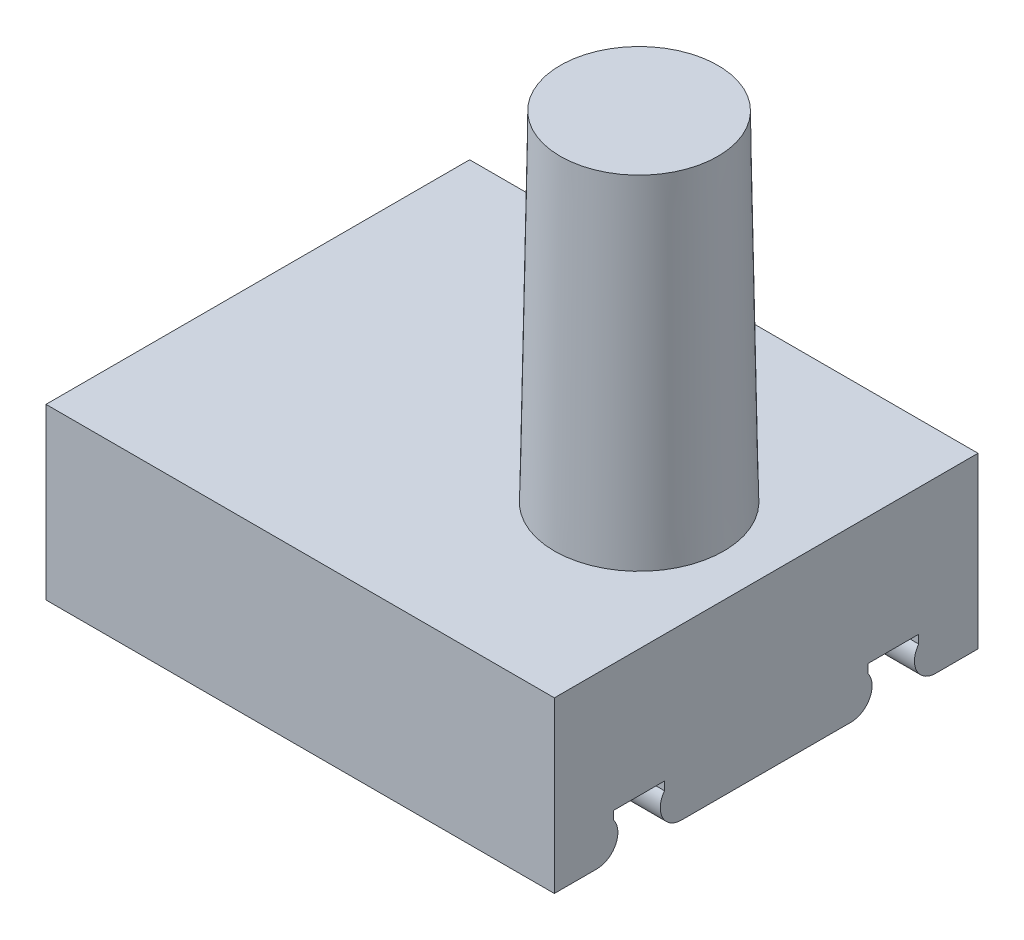
ISO-10303-21;
HEADER;
FILE_DESCRIPTION(('STEP AP214'),'2;1');
FILE_NAME('part.step','',(''),(''),'','','');
FILE_SCHEMA(('AUTOMOTIVE_DESIGN { 1 0 10303 214 1 1 1 1 }'));
ENDSEC;
DATA;
#1=APPLICATION_CONTEXT('core data for automotive mechanical design processes');
#2=APPLICATION_PROTOCOL_DEFINITION('international standard','automotive_design',2000,#1);
#3=PRODUCT_CONTEXT('',#1,'mechanical');
#4=PRODUCT('Part','Part','',(#3));
#5=PRODUCT_RELATED_PRODUCT_CATEGORY('part','',(#4));
#6=PRODUCT_DEFINITION_FORMATION('','',#4);
#7=PRODUCT_DEFINITION_CONTEXT('part definition',#1,'design');
#8=PRODUCT_DEFINITION('design','',#6,#7);
#9=PRODUCT_DEFINITION_SHAPE('','',#8);
#10=(LENGTH_UNIT() NAMED_UNIT(*) SI_UNIT(.MILLI.,.METRE.));
#11=(NAMED_UNIT(*) PLANE_ANGLE_UNIT() SI_UNIT($,.RADIAN.));
#12=(NAMED_UNIT(*) SI_UNIT($,.STERADIAN.) SOLID_ANGLE_UNIT());
#13=UNCERTAINTY_MEASURE_WITH_UNIT(LENGTH_MEASURE(1.E-05),#10,'distance_accuracy_value','');
#14=(GEOMETRIC_REPRESENTATION_CONTEXT(3) GLOBAL_UNCERTAINTY_ASSIGNED_CONTEXT((#13)) GLOBAL_UNIT_ASSIGNED_CONTEXT((#10,
#11,#12)) REPRESENTATION_CONTEXT('',''));
#15=CARTESIAN_POINT('',(0.,0.,0.));
#16=DIRECTION('',(0.,0.,1.));
#17=DIRECTION('',(1.,0.,0.));
#18=AXIS2_PLACEMENT_3D('',#15,#16,#17);
#19=CARTESIAN_POINT('',(60.,50.,0.));
#20=DIRECTION('',(0.,-1.,0.));
#21=DIRECTION('',(0.,0.,-1.));
#22=AXIS2_PLACEMENT_3D('',#19,#20,#21);
#23=PLANE('',#22);
#24=CARTESIAN_POINT('',(45.,50.,100.));
#25=DIRECTION('',(0.,1.,0.));
#26=DIRECTION('',(0.,0.,1.));
#27=AXIS2_PLACEMENT_3D('',#24,#25,#26);
#28=CIRCLE('',#27,10.);
#29=CARTESIAN_POINT('',(45.,50.,110.));
#30=VERTEX_POINT('',#29);
#31=EDGE_CURVE('E11',#30,#30,#28,.T.);
#32=ORIENTED_EDGE('',*,*,#31,.F.);
#33=EDGE_LOOP('',(#32));
#34=FACE_BOUND('',#33,.T.);
#35=DIRECTION('',(0.,0.,1.));
#36=VECTOR('',#35,1.);
#37=CARTESIAN_POINT('',(0.,50.,0.));
#38=LINE('',#37,#36);
#39=CARTESIAN_POINT('',(0.,50.,75.));
#40=VERTEX_POINT('',#39);
#41=CARTESIAN_POINT('',(0.,50.,125.));
#42=VERTEX_POINT('',#41);
#43=EDGE_CURVE('E189',#40,#42,#38,.T.);
#44=ORIENTED_EDGE('',*,*,#43,.T.);
#45=DIRECTION('',(-1.,0.,0.));
#46=VECTOR('',#45,1.);
#47=CARTESIAN_POINT('',(60.,50.,125.));
#48=LINE('',#47,#46);
#49=CARTESIAN_POINT('',(60.,50.,125.));
#50=VERTEX_POINT('',#49);
#51=EDGE_CURVE('E55',#50,#42,#48,.T.);
#52=ORIENTED_EDGE('',*,*,#51,.F.);
#53=DIRECTION('',(0.,0.,1.));
#54=VECTOR('',#53,1.);
#55=CARTESIAN_POINT('',(60.,50.,0.));
#56=LINE('',#55,#54);
#57=CARTESIAN_POINT('',(60.,50.,75.));
#58=VERTEX_POINT('',#57);
#59=EDGE_CURVE('E219',#58,#50,#56,.T.);
#60=ORIENTED_EDGE('',*,*,#59,.F.);
#61=DIRECTION('',(-1.,0.,0.));
#62=VECTOR('',#61,1.);
#63=CARTESIAN_POINT('',(60.,50.,75.));
#64=LINE('',#63,#62);
#65=EDGE_CURVE('E46',#58,#40,#64,.T.);
#66=ORIENTED_EDGE('',*,*,#65,.T.);
#67=EDGE_LOOP('',(#44,#52,#60,#66));
#68=FACE_BOUND('',#67,.T.);
#69=ADVANCED_FACE('F43',(#34,#68),#23,.F.);
#70=CARTESIAN_POINT('',(60.,0.,125.));
#71=DIRECTION('',(0.,0.,-1.));
#72=DIRECTION('',(-1.,0.,0.));
#73=AXIS2_PLACEMENT_3D('',#70,#71,#72);
#74=PLANE('',#73);
#75=DIRECTION('',(0.,-1.,0.));
#76=VECTOR('',#75,1.);
#77=CARTESIAN_POINT('',(0.,0.,125.));
#78=LINE('',#77,#76);
#79=CARTESIAN_POINT('',(0.,30.,125.));
#80=VERTEX_POINT('',#79);
#81=EDGE_CURVE('E111',#42,#80,#78,.T.);
#82=ORIENTED_EDGE('',*,*,#81,.T.);
#83=DIRECTION('',(-1.,0.,0.));
#84=VECTOR('',#83,1.);
#85=CARTESIAN_POINT('',(60.,30.,125.));
#86=LINE('',#85,#84);
#87=CARTESIAN_POINT('',(60.,30.,125.));
#88=VERTEX_POINT('',#87);
#89=EDGE_CURVE('E174',#88,#80,#86,.T.);
#90=ORIENTED_EDGE('',*,*,#89,.F.);
#91=DIRECTION('',(0.,-1.,0.));
#92=VECTOR('',#91,1.);
#93=CARTESIAN_POINT('',(60.,0.,125.));
#94=LINE('',#93,#92);
#95=EDGE_CURVE('E62',#50,#88,#94,.T.);
#96=ORIENTED_EDGE('',*,*,#95,.F.);
#97=ORIENTED_EDGE('',*,*,#51,.T.);
#98=EDGE_LOOP('',(#82,#90,#96,#97));
#99=FACE_BOUND('',#98,.T.);
#100=ADVANCED_FACE('F279',(#99),#74,.F.);
#101=CARTESIAN_POINT('',(60.,30.,0.));
#102=DIRECTION('',(0.,1.,0.));
#103=DIRECTION('',(0.,0.,1.));
#104=AXIS2_PLACEMENT_3D('',#101,#102,#103);
#105=PLANE('',#104);
#106=DIRECTION('',(0.,0.,-1.));
#107=VECTOR('',#106,1.);
#108=CARTESIAN_POINT('',(0.,30.,0.));
#109=LINE('',#108,#107);
#110=CARTESIAN_POINT('',(0.,30.,120.));
#111=VERTEX_POINT('',#110);
#112=EDGE_CURVE('E175',#80,#111,#109,.T.);
#113=ORIENTED_EDGE('',*,*,#112,.T.);
#114=DIRECTION('',(-1.,0.,0.));
#115=VECTOR('',#114,1.);
#116=CARTESIAN_POINT('',(60.,30.,120.));
#117=LINE('',#116,#115);
#118=CARTESIAN_POINT('',(60.,30.,120.));
#119=VERTEX_POINT('',#118);
#120=EDGE_CURVE('E167',#119,#111,#117,.T.);
#121=ORIENTED_EDGE('',*,*,#120,.F.);
#122=DIRECTION('',(0.,0.,-1.));
#123=VECTOR('',#122,1.);
#124=CARTESIAN_POINT('',(60.,30.,0.));
#125=LINE('',#124,#123);
#126=EDGE_CURVE('E163',#88,#119,#125,.T.);
#127=ORIENTED_EDGE('',*,*,#126,.F.);
#128=ORIENTED_EDGE('',*,*,#89,.T.);
#129=EDGE_LOOP('',(#113,#121,#127,#128));
#130=FACE_BOUND('',#129,.T.);
#131=ADVANCED_FACE('F171',(#130),#105,.F.);
#132=CARTESIAN_POINT('',(60.,32.5,120.));
#133=DIRECTION('',(-1.,0.,0.));
#134=DIRECTION('',(0.,0.,1.));
#135=AXIS2_PLACEMENT_3D('',#132,#133,#134);
#136=CYLINDRICAL_SURFACE('',#135,2.5);
#137=CARTESIAN_POINT('',(0.,32.5,120.));
#138=DIRECTION('',(-1.,0.,0.));
#139=DIRECTION('',(0.,0.,1.));
#140=AXIS2_PLACEMENT_3D('',#137,#138,#139);
#141=CIRCLE('',#140,2.5);
#142=CARTESIAN_POINT('',(0.,34.,118.));
#143=VERTEX_POINT('',#142);
#144=EDGE_CURVE('E216',#111,#143,#141,.F.);
#145=ORIENTED_EDGE('',*,*,#144,.T.);
#146=DIRECTION('',(-1.,0.,0.));
#147=VECTOR('',#146,1.);
#148=CARTESIAN_POINT('',(60.,34.,118.));
#149=LINE('',#148,#147);
#150=CARTESIAN_POINT('',(60.,34.,118.));
#151=VERTEX_POINT('',#150);
#152=EDGE_CURVE('E176',#151,#143,#149,.T.);
#153=ORIENTED_EDGE('',*,*,#152,.F.);
#154=CARTESIAN_POINT('',(60.,32.5,120.));
#155=DIRECTION('',(-1.,0.,0.));
#156=DIRECTION('',(0.,0.,1.));
#157=AXIS2_PLACEMENT_3D('',#154,#155,#156);
#158=CIRCLE('',#157,2.5);
#159=EDGE_CURVE('E164',#119,#151,#158,.F.);
#160=ORIENTED_EDGE('',*,*,#159,.F.);
#161=ORIENTED_EDGE('',*,*,#120,.T.);
#162=EDGE_LOOP('',(#145,#153,#160,#161));
#163=FACE_BOUND('',#162,.T.);
#164=ADVANCED_FACE('F178',(#163),#136,.T.);
#165=CARTESIAN_POINT('',(60.,0.,118.));
#166=DIRECTION('',(0.,0.,1.));
#167=DIRECTION('',(1.,0.,0.));
#168=AXIS2_PLACEMENT_3D('',#165,#166,#167);
#169=PLANE('',#168);
#170=DIRECTION('',(0.,1.,0.));
#171=VECTOR('',#170,1.);
#172=CARTESIAN_POINT('',(0.,0.,118.));
#173=LINE('',#172,#171);
#174=CARTESIAN_POINT('',(0.,35.,118.));
#175=VERTEX_POINT('',#174);
#176=EDGE_CURVE('E211',#143,#175,#173,.T.);
#177=ORIENTED_EDGE('',*,*,#176,.T.);
#178=DIRECTION('',(-1.,0.,0.));
#179=VECTOR('',#178,1.);
#180=CARTESIAN_POINT('',(60.,35.,118.));
#181=LINE('',#180,#179);
#182=CARTESIAN_POINT('',(60.,35.,118.));
#183=VERTEX_POINT('',#182);
#184=EDGE_CURVE('E223',#183,#175,#181,.T.);
#185=ORIENTED_EDGE('',*,*,#184,.F.);
#186=DIRECTION('',(0.,1.,0.));
#187=VECTOR('',#186,1.);
#188=CARTESIAN_POINT('',(60.,0.,118.));
#189=LINE('',#188,#187);
#190=EDGE_CURVE('E181',#151,#183,#189,.T.);
#191=ORIENTED_EDGE('',*,*,#190,.F.);
#192=ORIENTED_EDGE('',*,*,#152,.T.);
#193=EDGE_LOOP('',(#177,#185,#191,#192));
#194=FACE_BOUND('',#193,.T.);
#195=ADVANCED_FACE('F308',(#194),#169,.F.);
#196=CARTESIAN_POINT('',(60.,35.,0.));
#197=DIRECTION('',(0.,1.,0.));
#198=DIRECTION('',(0.,0.,1.));
#199=AXIS2_PLACEMENT_3D('',#196,#197,#198);
#200=PLANE('',#199);
#201=DIRECTION('',(0.,0.,-1.));
#202=VECTOR('',#201,1.);
#203=CARTESIAN_POINT('',(0.,35.,0.));
#204=LINE('',#203,#202);
#205=CARTESIAN_POINT('',(0.,35.,112.));
#206=VERTEX_POINT('',#205);
#207=EDGE_CURVE('E215',#175,#206,#204,.T.);
#208=ORIENTED_EDGE('',*,*,#207,.T.);
#209=DIRECTION('',(-1.,0.,0.));
#210=VECTOR('',#209,1.);
#211=CARTESIAN_POINT('',(60.,35.,112.));
#212=LINE('',#211,#210);
#213=CARTESIAN_POINT('',(60.,35.,112.));
#214=VERTEX_POINT('',#213);
#215=EDGE_CURVE('E227',#214,#206,#212,.T.);
#216=ORIENTED_EDGE('',*,*,#215,.F.);
#217=DIRECTION('',(0.,0.,-1.));
#218=VECTOR('',#217,1.);
#219=CARTESIAN_POINT('',(60.,35.,0.));
#220=LINE('',#219,#218);
#221=EDGE_CURVE('E182',#183,#214,#220,.T.);
#222=ORIENTED_EDGE('',*,*,#221,.F.);
#223=ORIENTED_EDGE('',*,*,#184,.T.);
#224=EDGE_LOOP('',(#208,#216,#222,#223));
#225=FACE_BOUND('',#224,.T.);
#226=ADVANCED_FACE('F311',(#225),#200,.F.);
#227=CARTESIAN_POINT('',(60.,0.,112.));
#228=DIRECTION('',(0.,0.,-1.));
#229=DIRECTION('',(-1.,0.,0.));
#230=AXIS2_PLACEMENT_3D('',#227,#228,#229);
#231=PLANE('',#230);
#232=DIRECTION('',(0.,-1.,0.));
#233=VECTOR('',#232,1.);
#234=CARTESIAN_POINT('',(0.,0.,112.));
#235=LINE('',#234,#233);
#236=CARTESIAN_POINT('',(0.,34.,112.));
#237=VERTEX_POINT('',#236);
#238=EDGE_CURVE('E208',#206,#237,#235,.T.);
#239=ORIENTED_EDGE('',*,*,#238,.T.);
#240=DIRECTION('',(-1.,0.,0.));
#241=VECTOR('',#240,1.);
#242=CARTESIAN_POINT('',(60.,34.,112.));
#243=LINE('',#242,#241);
#244=CARTESIAN_POINT('',(60.,34.,112.));
#245=VERTEX_POINT('',#244);
#246=EDGE_CURVE('E229',#245,#237,#243,.T.);
#247=ORIENTED_EDGE('',*,*,#246,.F.);
#248=DIRECTION('',(0.,-1.,0.));
#249=VECTOR('',#248,1.);
#250=CARTESIAN_POINT('',(60.,0.,112.));
#251=LINE('',#250,#249);
#252=EDGE_CURVE('E372',#214,#245,#251,.T.);
#253=ORIENTED_EDGE('',*,*,#252,.F.);
#254=ORIENTED_EDGE('',*,*,#215,.T.);
#255=EDGE_LOOP('',(#239,#247,#253,#254));
#256=FACE_BOUND('',#255,.T.);
#257=ADVANCED_FACE('F314',(#256),#231,.F.);
#258=CARTESIAN_POINT('',(60.,32.5,110.));
#259=DIRECTION('',(-1.,0.,0.));
#260=DIRECTION('',(0.,0.,1.));
#261=AXIS2_PLACEMENT_3D('',#258,#259,#260);
#262=CYLINDRICAL_SURFACE('',#261,2.5);
#263=CARTESIAN_POINT('',(0.,32.5,110.));
#264=DIRECTION('',(-1.,0.,0.));
#265=DIRECTION('',(0.,0.,1.));
#266=AXIS2_PLACEMENT_3D('',#263,#264,#265);
#267=CIRCLE('',#266,2.5);
#268=CARTESIAN_POINT('',(0.,30.,110.));
#269=VERTEX_POINT('',#268);
#270=EDGE_CURVE('E206',#237,#269,#267,.F.);
#271=ORIENTED_EDGE('',*,*,#270,.T.);
#272=DIRECTION('',(-1.,0.,0.));
#273=VECTOR('',#272,1.);
#274=CARTESIAN_POINT('',(60.,30.,110.));
#275=LINE('',#274,#273);
#276=CARTESIAN_POINT('',(60.,30.,110.));
#277=VERTEX_POINT('',#276);
#278=EDGE_CURVE('E231',#277,#269,#275,.T.);
#279=ORIENTED_EDGE('',*,*,#278,.F.);
#280=CARTESIAN_POINT('',(60.,32.5,110.));
#281=DIRECTION('',(-1.,0.,0.));
#282=DIRECTION('',(0.,0.,1.));
#283=AXIS2_PLACEMENT_3D('',#280,#281,#282);
#284=CIRCLE('',#283,2.5);
#285=EDGE_CURVE('E375',#245,#277,#284,.F.);
#286=ORIENTED_EDGE('',*,*,#285,.F.);
#287=ORIENTED_EDGE('',*,*,#246,.T.);
#288=EDGE_LOOP('',(#271,#279,#286,#287));
#289=FACE_BOUND('',#288,.T.);
#290=ADVANCED_FACE('F316',(#289),#262,.T.);
#291=CARTESIAN_POINT('',(60.,30.,0.));
#292=DIRECTION('',(0.,1.,0.));
#293=DIRECTION('',(0.,0.,1.));
#294=AXIS2_PLACEMENT_3D('',#291,#292,#293);
#295=PLANE('',#294);
#296=DIRECTION('',(0.,0.,-1.));
#297=VECTOR('',#296,1.);
#298=CARTESIAN_POINT('',(0.,30.,0.));
#299=LINE('',#298,#297);
#300=CARTESIAN_POINT('',(0.,30.,90.));
#301=VERTEX_POINT('',#300);
#302=EDGE_CURVE('E207',#269,#301,#299,.T.);
#303=ORIENTED_EDGE('',*,*,#302,.T.);
#304=DIRECTION('',(-1.,0.,0.));
#305=VECTOR('',#304,1.);
#306=CARTESIAN_POINT('',(60.,30.,90.));
#307=LINE('',#306,#305);
#308=CARTESIAN_POINT('',(60.,30.,90.));
#309=VERTEX_POINT('',#308);
#310=EDGE_CURVE('E236',#309,#301,#307,.T.);
#311=ORIENTED_EDGE('',*,*,#310,.F.);
#312=DIRECTION('',(0.,0.,-1.));
#313=VECTOR('',#312,1.);
#314=CARTESIAN_POINT('',(60.,30.,0.));
#315=LINE('',#314,#313);
#316=EDGE_CURVE('E369',#277,#309,#315,.T.);
#317=ORIENTED_EDGE('',*,*,#316,.F.);
#318=ORIENTED_EDGE('',*,*,#278,.T.);
#319=EDGE_LOOP('',(#303,#311,#317,#318));
#320=FACE_BOUND('',#319,.T.);
#321=ADVANCED_FACE('F324',(#320),#295,.F.);
#322=CARTESIAN_POINT('',(60.,32.5,90.));
#323=DIRECTION('',(-1.,0.,0.));
#324=DIRECTION('',(0.,0.,1.));
#325=AXIS2_PLACEMENT_3D('',#322,#323,#324);
#326=CYLINDRICAL_SURFACE('',#325,2.5);
#327=CARTESIAN_POINT('',(0.,32.5,90.));
#328=DIRECTION('',(-1.,0.,0.));
#329=DIRECTION('',(0.,0.,1.));
#330=AXIS2_PLACEMENT_3D('',#327,#328,#329);
#331=CIRCLE('',#330,2.5);
#332=CARTESIAN_POINT('',(0.,34.,88.));
#333=VERTEX_POINT('',#332);
#334=EDGE_CURVE('E203',#301,#333,#331,.F.);
#335=ORIENTED_EDGE('',*,*,#334,.T.);
#336=DIRECTION('',(-1.,0.,0.));
#337=VECTOR('',#336,1.);
#338=CARTESIAN_POINT('',(60.,34.,88.));
#339=LINE('',#338,#337);
#340=CARTESIAN_POINT('',(60.,34.,88.));
#341=VERTEX_POINT('',#340);
#342=EDGE_CURVE('E237',#341,#333,#339,.T.);
#343=ORIENTED_EDGE('',*,*,#342,.F.);
#344=CARTESIAN_POINT('',(60.,32.5,90.));
#345=DIRECTION('',(-1.,0.,0.));
#346=DIRECTION('',(0.,0.,1.));
#347=AXIS2_PLACEMENT_3D('',#344,#345,#346);
#348=CIRCLE('',#347,2.5);
#349=EDGE_CURVE('E368',#309,#341,#348,.F.);
#350=ORIENTED_EDGE('',*,*,#349,.F.);
#351=ORIENTED_EDGE('',*,*,#310,.T.);
#352=EDGE_LOOP('',(#335,#343,#350,#351));
#353=FACE_BOUND('',#352,.T.);
#354=ADVANCED_FACE('F330',(#353),#326,.T.);
#355=CARTESIAN_POINT('',(60.,0.,88.));
#356=DIRECTION('',(0.,0.,1.));
#357=DIRECTION('',(1.,0.,0.));
#358=AXIS2_PLACEMENT_3D('',#355,#356,#357);
#359=PLANE('',#358);
#360=DIRECTION('',(0.,1.,0.));
#361=VECTOR('',#360,1.);
#362=CARTESIAN_POINT('',(0.,0.,88.));
#363=LINE('',#362,#361);
#364=CARTESIAN_POINT('',(0.,35.,88.));
#365=VERTEX_POINT('',#364);
#366=EDGE_CURVE('E205',#333,#365,#363,.T.);
#367=ORIENTED_EDGE('',*,*,#366,.T.);
#368=DIRECTION('',(-1.,0.,0.));
#369=VECTOR('',#368,1.);
#370=CARTESIAN_POINT('',(60.,35.,88.));
#371=LINE('',#370,#369);
#372=CARTESIAN_POINT('',(60.,35.,88.));
#373=VERTEX_POINT('',#372);
#374=EDGE_CURVE('E245',#373,#365,#371,.T.);
#375=ORIENTED_EDGE('',*,*,#374,.F.);
#376=DIRECTION('',(0.,1.,0.));
#377=VECTOR('',#376,1.);
#378=CARTESIAN_POINT('',(60.,0.,88.));
#379=LINE('',#378,#377);
#380=EDGE_CURVE('E366',#341,#373,#379,.T.);
#381=ORIENTED_EDGE('',*,*,#380,.F.);
#382=ORIENTED_EDGE('',*,*,#342,.T.);
#383=EDGE_LOOP('',(#367,#375,#381,#382));
#384=FACE_BOUND('',#383,.T.);
#385=ADVANCED_FACE('F331',(#384),#359,.F.);
#386=CARTESIAN_POINT('',(60.,35.,0.));
#387=DIRECTION('',(0.,1.,0.));
#388=DIRECTION('',(0.,0.,1.));
#389=AXIS2_PLACEMENT_3D('',#386,#387,#388);
#390=PLANE('',#389);
#391=DIRECTION('',(0.,0.,-1.));
#392=VECTOR('',#391,1.);
#393=CARTESIAN_POINT('',(0.,35.,0.));
#394=LINE('',#393,#392);
#395=CARTESIAN_POINT('',(0.,35.,82.));
#396=VERTEX_POINT('',#395);
#397=EDGE_CURVE('E199',#365,#396,#394,.T.);
#398=ORIENTED_EDGE('',*,*,#397,.T.);
#399=DIRECTION('',(-1.,0.,0.));
#400=VECTOR('',#399,1.);
#401=CARTESIAN_POINT('',(60.,35.,82.));
#402=LINE('',#401,#400);
#403=CARTESIAN_POINT('',(60.,35.,82.));
#404=VERTEX_POINT('',#403);
#405=EDGE_CURVE('E244',#404,#396,#402,.T.);
#406=ORIENTED_EDGE('',*,*,#405,.F.);
#407=DIRECTION('',(0.,0.,-1.));
#408=VECTOR('',#407,1.);
#409=CARTESIAN_POINT('',(60.,35.,0.));
#410=LINE('',#409,#408);
#411=EDGE_CURVE('E364',#373,#404,#410,.T.);
#412=ORIENTED_EDGE('',*,*,#411,.F.);
#413=ORIENTED_EDGE('',*,*,#374,.T.);
#414=EDGE_LOOP('',(#398,#406,#412,#413));
#415=FACE_BOUND('',#414,.T.);
#416=ADVANCED_FACE('F334',(#415),#390,.F.);
#417=CARTESIAN_POINT('',(60.,0.,82.));
#418=DIRECTION('',(0.,0.,-1.));
#419=DIRECTION('',(-1.,0.,0.));
#420=AXIS2_PLACEMENT_3D('',#417,#418,#419);
#421=PLANE('',#420);
#422=DIRECTION('',(0.,-1.,0.));
#423=VECTOR('',#422,1.);
#424=CARTESIAN_POINT('',(0.,0.,82.));
#425=LINE('',#424,#423);
#426=CARTESIAN_POINT('',(0.,34.,82.));
#427=VERTEX_POINT('',#426);
#428=EDGE_CURVE('E198',#396,#427,#425,.T.);
#429=ORIENTED_EDGE('',*,*,#428,.T.);
#430=DIRECTION('',(-1.,0.,0.));
#431=VECTOR('',#430,1.);
#432=CARTESIAN_POINT('',(60.,34.,82.));
#433=LINE('',#432,#431);
#434=CARTESIAN_POINT('',(60.,34.,82.));
#435=VERTEX_POINT('',#434);
#436=EDGE_CURVE('E247',#435,#427,#433,.T.);
#437=ORIENTED_EDGE('',*,*,#436,.F.);
#438=DIRECTION('',(0.,-1.,0.));
#439=VECTOR('',#438,1.);
#440=CARTESIAN_POINT('',(60.,0.,82.));
#441=LINE('',#440,#439);
#442=EDGE_CURVE('E356',#404,#435,#441,.T.);
#443=ORIENTED_EDGE('',*,*,#442,.F.);
#444=ORIENTED_EDGE('',*,*,#405,.T.);
#445=EDGE_LOOP('',(#429,#437,#443,#444));
#446=FACE_BOUND('',#445,.T.);
#447=ADVANCED_FACE('F339',(#446),#421,.F.);
#448=CARTESIAN_POINT('',(60.,32.5,80.));
#449=DIRECTION('',(-1.,0.,0.));
#450=DIRECTION('',(0.,0.,1.));
#451=AXIS2_PLACEMENT_3D('',#448,#449,#450);
#452=CYLINDRICAL_SURFACE('',#451,2.5);
#453=CARTESIAN_POINT('',(0.,32.5,80.));
#454=DIRECTION('',(-1.,0.,0.));
#455=DIRECTION('',(0.,0.,1.));
#456=AXIS2_PLACEMENT_3D('',#453,#454,#455);
#457=CIRCLE('',#456,2.5);
#458=CARTESIAN_POINT('',(0.,30.,80.));
#459=VERTEX_POINT('',#458);
#460=EDGE_CURVE('E196',#427,#459,#457,.F.);
#461=ORIENTED_EDGE('',*,*,#460,.T.);
#462=DIRECTION('',(-1.,0.,0.));
#463=VECTOR('',#462,1.);
#464=CARTESIAN_POINT('',(60.,30.,80.));
#465=LINE('',#464,#463);
#466=CARTESIAN_POINT('',(60.,30.,80.));
#467=VERTEX_POINT('',#466);
#468=EDGE_CURVE('E252',#467,#459,#465,.T.);
#469=ORIENTED_EDGE('',*,*,#468,.F.);
#470=CARTESIAN_POINT('',(60.,32.5,80.));
#471=DIRECTION('',(-1.,0.,0.));
#472=DIRECTION('',(0.,0.,1.));
#473=AXIS2_PLACEMENT_3D('',#470,#471,#472);
#474=CIRCLE('',#473,2.5);
#475=EDGE_CURVE('E358',#435,#467,#474,.F.);
#476=ORIENTED_EDGE('',*,*,#475,.F.);
#477=ORIENTED_EDGE('',*,*,#436,.T.);
#478=EDGE_LOOP('',(#461,#469,#476,#477));
#479=FACE_BOUND('',#478,.T.);
#480=ADVANCED_FACE('F274',(#479),#452,.T.);
#481=CARTESIAN_POINT('',(60.,30.,0.));
#482=DIRECTION('',(0.,1.,0.));
#483=DIRECTION('',(0.,0.,1.));
#484=AXIS2_PLACEMENT_3D('',#481,#482,#483);
#485=PLANE('',#484);
#486=DIRECTION('',(0.,0.,-1.));
#487=VECTOR('',#486,1.);
#488=CARTESIAN_POINT('',(0.,30.,0.));
#489=LINE('',#488,#487);
#490=CARTESIAN_POINT('',(0.,30.,75.));
#491=VERTEX_POINT('',#490);
#492=EDGE_CURVE('E191',#459,#491,#489,.T.);
#493=ORIENTED_EDGE('',*,*,#492,.T.);
#494=DIRECTION('',(-1.,0.,0.));
#495=VECTOR('',#494,1.);
#496=CARTESIAN_POINT('',(60.,30.,75.));
#497=LINE('',#496,#495);
#498=CARTESIAN_POINT('',(60.,30.,75.));
#499=VERTEX_POINT('',#498);
#500=EDGE_CURVE('E254',#499,#491,#497,.T.);
#501=ORIENTED_EDGE('',*,*,#500,.F.);
#502=DIRECTION('',(0.,0.,-1.));
#503=VECTOR('',#502,1.);
#504=CARTESIAN_POINT('',(60.,30.,0.));
#505=LINE('',#504,#503);
#506=EDGE_CURVE('E354',#467,#499,#505,.T.);
#507=ORIENTED_EDGE('',*,*,#506,.F.);
#508=ORIENTED_EDGE('',*,*,#468,.T.);
#509=EDGE_LOOP('',(#493,#501,#507,#508));
#510=FACE_BOUND('',#509,.T.);
#511=ADVANCED_FACE('F270',(#510),#485,.F.);
#512=CARTESIAN_POINT('',(60.,0.,75.));
#513=DIRECTION('',(0.,0.,1.));
#514=DIRECTION('',(1.,0.,0.));
#515=AXIS2_PLACEMENT_3D('',#512,#513,#514);
#516=PLANE('',#515);
#517=DIRECTION('',(0.,1.,0.));
#518=VECTOR('',#517,1.);
#519=CARTESIAN_POINT('',(0.,0.,75.));
#520=LINE('',#519,#518);
#521=EDGE_CURVE('E192',#491,#40,#520,.T.);
#522=ORIENTED_EDGE('',*,*,#521,.T.);
#523=ORIENTED_EDGE('',*,*,#65,.F.);
#524=DIRECTION('',(0.,1.,0.));
#525=VECTOR('',#524,1.);
#526=CARTESIAN_POINT('',(60.,0.,75.));
#527=LINE('',#526,#525);
#528=EDGE_CURVE('E124',#499,#58,#527,.T.);
#529=ORIENTED_EDGE('',*,*,#528,.F.);
#530=ORIENTED_EDGE('',*,*,#500,.T.);
#531=EDGE_LOOP('',(#522,#523,#529,#530));
#532=FACE_BOUND('',#531,.T.);
#533=ADVANCED_FACE('F264',(#532),#516,.F.);
#534=CARTESIAN_POINT('',(60.,0.,0.));
#535=DIRECTION('',(-1.,0.,0.));
#536=DIRECTION('',(0.,0.,1.));
#537=AXIS2_PLACEMENT_3D('',#534,#535,#536);
#538=PLANE('',#537);
#539=ORIENTED_EDGE('',*,*,#59,.T.);
#540=ORIENTED_EDGE('',*,*,#95,.T.);
#541=ORIENTED_EDGE('',*,*,#126,.T.);
#542=ORIENTED_EDGE('',*,*,#159,.T.);
#543=ORIENTED_EDGE('',*,*,#190,.T.);
#544=ORIENTED_EDGE('',*,*,#221,.T.);
#545=ORIENTED_EDGE('',*,*,#252,.T.);
#546=ORIENTED_EDGE('',*,*,#285,.T.);
#547=ORIENTED_EDGE('',*,*,#316,.T.);
#548=ORIENTED_EDGE('',*,*,#349,.T.);
#549=ORIENTED_EDGE('',*,*,#380,.T.);
#550=ORIENTED_EDGE('',*,*,#411,.T.);
#551=ORIENTED_EDGE('',*,*,#442,.T.);
#552=ORIENTED_EDGE('',*,*,#475,.T.);
#553=ORIENTED_EDGE('',*,*,#506,.T.);
#554=ORIENTED_EDGE('',*,*,#528,.T.);
#555=EDGE_LOOP('',(#539,#540,#541,#542,#543,#544,#545,#546,#547,#548,#549,#550,#551,#552,#553,#554));
#556=FACE_BOUND('',#555,.T.);
#557=ADVANCED_FACE('F161',(#556),#538,.F.);
#558=CARTESIAN_POINT('',(0.,0.,0.));
#559=DIRECTION('',(-1.,0.,0.));
#560=DIRECTION('',(0.,0.,1.));
#561=AXIS2_PLACEMENT_3D('',#558,#559,#560);
#562=PLANE('',#561);
#563=ORIENTED_EDGE('',*,*,#43,.F.);
#564=ORIENTED_EDGE('',*,*,#521,.F.);
#565=ORIENTED_EDGE('',*,*,#492,.F.);
#566=ORIENTED_EDGE('',*,*,#460,.F.);
#567=ORIENTED_EDGE('',*,*,#428,.F.);
#568=ORIENTED_EDGE('',*,*,#397,.F.);
#569=ORIENTED_EDGE('',*,*,#366,.F.);
#570=ORIENTED_EDGE('',*,*,#334,.F.);
#571=ORIENTED_EDGE('',*,*,#302,.F.);
#572=ORIENTED_EDGE('',*,*,#270,.F.);
#573=ORIENTED_EDGE('',*,*,#238,.F.);
#574=ORIENTED_EDGE('',*,*,#207,.F.);
#575=ORIENTED_EDGE('',*,*,#176,.F.);
#576=ORIENTED_EDGE('',*,*,#144,.F.);
#577=ORIENTED_EDGE('',*,*,#112,.F.);
#578=ORIENTED_EDGE('',*,*,#81,.F.);
#579=EDGE_LOOP('',(#563,#564,#565,#566,#567,#568,#569,#570,#571,#572,#573,#574,#575,#576,#577,#578));
#580=FACE_BOUND('',#579,.T.);
#581=ADVANCED_FACE('F265',(#580),#562,.T.);
#582=CARTESIAN_POINT('',(45.,50.,100.));
#583=DIRECTION('',(0.,-1.,0.));
#584=DIRECTION('',(0.,0.,1.));
#585=AXIS2_PLACEMENT_3D('',#582,#583,#584);
#586=CONICAL_SURFACE('',#585,10.,0.0174532925199433);
#587=CARTESIAN_POINT('',(45.,90.,100.));
#588=DIRECTION('',(0.,1.,0.));
#589=DIRECTION('',(0.,0.,1.));
#590=AXIS2_PLACEMENT_3D('',#587,#588,#589);
#591=CIRCLE('',#590,9.3017974028713);
#592=CARTESIAN_POINT('',(45.,90.,109.301797402871));
#593=VERTEX_POINT('',#592);
#594=EDGE_CURVE('E195',#593,#593,#591,.T.);
#595=ORIENTED_EDGE('',*,*,#594,.F.);
#596=EDGE_LOOP('',(#595));
#597=FACE_BOUND('',#596,.T.);
#598=ORIENTED_EDGE('',*,*,#31,.T.);
#599=EDGE_LOOP('',(#598));
#600=FACE_BOUND('',#599,.T.);
#601=ADVANCED_FACE('F287',(#597,#600),#586,.T.);
#602=CARTESIAN_POINT('',(0.,90.,0.));
#603=DIRECTION('',(0.,1.,0.));
#604=DIRECTION('',(0.,0.,1.));
#605=AXIS2_PLACEMENT_3D('',#602,#603,#604);
#606=PLANE('',#605);
#607=ORIENTED_EDGE('',*,*,#594,.T.);
#608=EDGE_LOOP('',(#607));
#609=FACE_BOUND('',#608,.T.);
#610=ADVANCED_FACE('F289',(#609),#606,.T.);
#611=CLOSED_SHELL('',(#69,#100,#131,#164,#195,#226,#257,#290,#321,#354,#385,#416,#447,#480,#511,
#533,#557,#581,#601,#610));
#612=MANIFOLD_SOLID_BREP('B2',#611);
#613=ADVANCED_BREP_SHAPE_REPRESENTATION('',(#18,#612),#14);
#614=SHAPE_DEFINITION_REPRESENTATION(#9,#613);
ENDSEC;
END-ISO-10303-21;
